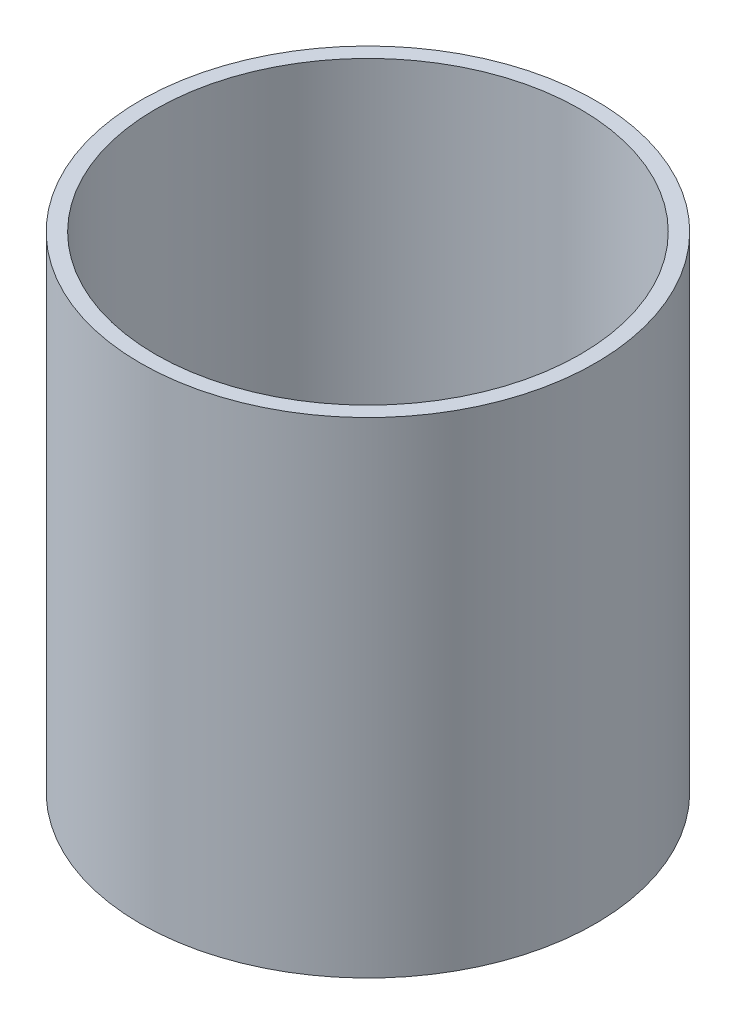
ISO-10303-21;
HEADER;
FILE_DESCRIPTION(('STEP AP214'),'2;1');
FILE_NAME('part.step','',(''),(''),'','','');
FILE_SCHEMA(('AUTOMOTIVE_DESIGN { 1 0 10303 214 1 1 1 1 }'));
ENDSEC;
DATA;
#1=APPLICATION_CONTEXT('core data for automotive mechanical design processes');
#2=APPLICATION_PROTOCOL_DEFINITION('international standard','automotive_design',2000,#1);
#3=PRODUCT_CONTEXT('',#1,'mechanical');
#4=PRODUCT('Part','Part','',(#3));
#5=PRODUCT_RELATED_PRODUCT_CATEGORY('part','',(#4));
#6=PRODUCT_DEFINITION_FORMATION('','',#4);
#7=PRODUCT_DEFINITION_CONTEXT('part definition',#1,'design');
#8=PRODUCT_DEFINITION('design','',#6,#7);
#9=PRODUCT_DEFINITION_SHAPE('','',#8);
#10=(LENGTH_UNIT() NAMED_UNIT(*) SI_UNIT(.MILLI.,.METRE.));
#11=(NAMED_UNIT(*) PLANE_ANGLE_UNIT() SI_UNIT($,.RADIAN.));
#12=(NAMED_UNIT(*) SI_UNIT($,.STERADIAN.) SOLID_ANGLE_UNIT());
#13=UNCERTAINTY_MEASURE_WITH_UNIT(LENGTH_MEASURE(1.E-05),#10,'distance_accuracy_value','');
#14=(GEOMETRIC_REPRESENTATION_CONTEXT(3) GLOBAL_UNCERTAINTY_ASSIGNED_CONTEXT((#13)) GLOBAL_UNIT_ASSIGNED_CONTEXT((#10,
#11,#12)) REPRESENTATION_CONTEXT('',''));
#15=CARTESIAN_POINT('',(0.,0.,0.));
#16=DIRECTION('',(0.,0.,1.));
#17=DIRECTION('',(1.,0.,0.));
#18=AXIS2_PLACEMENT_3D('',#15,#16,#17);
#19=CARTESIAN_POINT('',(0.,0.,0.));
#20=DIRECTION('',(0.,1.,0.));
#21=DIRECTION('',(0.,0.,1.));
#22=AXIS2_PLACEMENT_3D('',#19,#20,#21);
#23=PLANE('',#22);
#24=CARTESIAN_POINT('',(0.,0.,0.));
#25=DIRECTION('',(0.,1.,0.));
#26=DIRECTION('',(0.,0.,1.));
#27=AXIS2_PLACEMENT_3D('',#24,#25,#26);
#28=CIRCLE('',#27,44.);
#29=CARTESIAN_POINT('',(0.,0.,44.));
#30=VERTEX_POINT('',#29);
#31=EDGE_CURVE('E35',#30,#30,#28,.T.);
#32=ORIENTED_EDGE('',*,*,#31,.T.);
#33=EDGE_LOOP('',(#32));
#34=FACE_BOUND('',#33,.T.);
#35=CARTESIAN_POINT('',(0.,0.,0.));
#36=DIRECTION('',(0.,1.,0.));
#37=DIRECTION('',(0.,0.,1.));
#38=AXIS2_PLACEMENT_3D('',#35,#36,#37);
#39=CIRCLE('',#38,48.);
#40=CARTESIAN_POINT('',(0.,0.,48.));
#41=VERTEX_POINT('',#40);
#42=EDGE_CURVE('E10',#41,#41,#39,.T.);
#43=ORIENTED_EDGE('',*,*,#42,.F.);
#44=EDGE_LOOP('',(#43));
#45=FACE_BOUND('',#44,.T.);
#46=ADVANCED_FACE('F32',(#34,#45),#23,.F.);
#47=CARTESIAN_POINT('',(0.,136.,0.));
#48=DIRECTION('',(0.,1.,0.));
#49=DIRECTION('',(0.,0.,1.));
#50=AXIS2_PLACEMENT_3D('',#47,#48,#49);
#51=CYLINDRICAL_SURFACE('',#50,48.);
#52=CARTESIAN_POINT('',(0.,8.00000000000001,0.));
#53=DIRECTION('',(0.,1.,0.));
#54=DIRECTION('',(0.,0.,1.));
#55=AXIS2_PLACEMENT_3D('',#52,#53,#54);
#56=CIRCLE('',#55,48.);
#57=CARTESIAN_POINT('',(0.,8.00000000000001,48.));
#58=VERTEX_POINT('',#57);
#59=EDGE_CURVE('E39',#58,#58,#56,.T.);
#60=ORIENTED_EDGE('',*,*,#59,.F.);
#61=EDGE_LOOP('',(#60));
#62=FACE_BOUND('',#61,.T.);
#63=ORIENTED_EDGE('',*,*,#42,.T.);
#64=EDGE_LOOP('',(#63));
#65=FACE_BOUND('',#64,.T.);
#66=ADVANCED_FACE('F78',(#62,#65),#51,.T.);
#67=CARTESIAN_POINT('',(48.,8.,0.));
#68=DIRECTION('',(0.,1.,0.));
#69=DIRECTION('',(0.,0.,1.));
#70=AXIS2_PLACEMENT_3D('',#67,#68,#69);
#71=PLANE('',#70);
#72=CARTESIAN_POINT('',(0.,8.00000000000001,0.));
#73=DIRECTION('',(0.,1.,0.));
#74=DIRECTION('',(0.,0.,1.));
#75=AXIS2_PLACEMENT_3D('',#72,#73,#74);
#76=CIRCLE('',#75,60.);
#77=CARTESIAN_POINT('',(0.,8.00000000000001,60.));
#78=VERTEX_POINT('',#77);
#79=EDGE_CURVE('E43',#78,#78,#76,.T.);
#80=ORIENTED_EDGE('',*,*,#79,.F.);
#81=EDGE_LOOP('',(#80));
#82=FACE_BOUND('',#81,.T.);
#83=ORIENTED_EDGE('',*,*,#59,.T.);
#84=EDGE_LOOP('',(#83));
#85=FACE_BOUND('',#84,.T.);
#86=ADVANCED_FACE('F83',(#82,#85),#71,.F.);
#87=CARTESIAN_POINT('',(0.,136.,0.));
#88=DIRECTION('',(0.,1.,0.));
#89=DIRECTION('',(0.,0.,1.));
#90=AXIS2_PLACEMENT_3D('',#87,#88,#89);
#91=CYLINDRICAL_SURFACE('',#90,60.);
#92=CARTESIAN_POINT('',(0.,136.,0.));
#93=DIRECTION('',(0.,1.,0.));
#94=DIRECTION('',(0.,0.,1.));
#95=AXIS2_PLACEMENT_3D('',#92,#93,#94);
#96=CIRCLE('',#95,60.);
#97=CARTESIAN_POINT('',(0.,136.,60.));
#98=VERTEX_POINT('',#97);
#99=EDGE_CURVE('E48',#98,#98,#96,.T.);
#100=ORIENTED_EDGE('',*,*,#99,.F.);
#101=EDGE_LOOP('',(#100));
#102=FACE_BOUND('',#101,.T.);
#103=ORIENTED_EDGE('',*,*,#79,.T.);
#104=EDGE_LOOP('',(#103));
#105=FACE_BOUND('',#104,.T.);
#106=ADVANCED_FACE('F91',(#102,#105),#91,.T.);
#107=CARTESIAN_POINT('',(60.,136.,0.));
#108=DIRECTION('',(0.,-1.,0.));
#109=DIRECTION('',(0.,0.,-1.));
#110=AXIS2_PLACEMENT_3D('',#107,#108,#109);
#111=PLANE('',#110);
#112=CARTESIAN_POINT('',(0.,136.,0.));
#113=DIRECTION('',(0.,-1.,0.));
#114=DIRECTION('',(0.,0.,-1.));
#115=AXIS2_PLACEMENT_3D('',#112,#113,#114);
#116=CIRCLE('',#115,56.);
#117=CARTESIAN_POINT('',(0.,136.,-56.));
#118=VERTEX_POINT('',#117);
#119=EDGE_CURVE('E52',#118,#118,#116,.F.);
#120=ORIENTED_EDGE('',*,*,#119,.F.);
#121=EDGE_LOOP('',(#120));
#122=FACE_BOUND('',#121,.T.);
#123=ORIENTED_EDGE('',*,*,#99,.T.);
#124=EDGE_LOOP('',(#123));
#125=FACE_BOUND('',#124,.T.);
#126=ADVANCED_FACE('F75',(#122,#125),#111,.F.);
#127=CARTESIAN_POINT('',(0.,136.,0.));
#128=DIRECTION('',(0.,1.,0.));
#129=DIRECTION('',(0.,0.,1.));
#130=AXIS2_PLACEMENT_3D('',#127,#128,#129);
#131=CYLINDRICAL_SURFACE('',#130,44.);
#132=CARTESIAN_POINT('',(0.,12.,0.));
#133=DIRECTION('',(0.,1.,0.));
#134=DIRECTION('',(0.,0.,1.));
#135=AXIS2_PLACEMENT_3D('',#132,#133,#134);
#136=CIRCLE('',#135,44.);
#137=CARTESIAN_POINT('',(0.,12.,44.));
#138=VERTEX_POINT('',#137);
#139=EDGE_CURVE('E51',#138,#138,#136,.T.);
#140=ORIENTED_EDGE('',*,*,#139,.T.);
#141=EDGE_LOOP('',(#140));
#142=FACE_BOUND('',#141,.T.);
#143=ORIENTED_EDGE('',*,*,#31,.F.);
#144=EDGE_LOOP('',(#143));
#145=FACE_BOUND('',#144,.T.);
#146=ADVANCED_FACE('F61',(#142,#145),#131,.F.);
#147=CARTESIAN_POINT('',(48.,12.,0.));
#148=DIRECTION('',(0.,1.,0.));
#149=DIRECTION('',(0.,0.,1.));
#150=AXIS2_PLACEMENT_3D('',#147,#148,#149);
#151=PLANE('',#150);
#152=CARTESIAN_POINT('',(0.,12.,0.));
#153=DIRECTION('',(0.,1.,0.));
#154=DIRECTION('',(0.,0.,1.));
#155=AXIS2_PLACEMENT_3D('',#152,#153,#154);
#156=CIRCLE('',#155,56.);
#157=CARTESIAN_POINT('',(0.,12.,56.));
#158=VERTEX_POINT('',#157);
#159=EDGE_CURVE('E55',#158,#158,#156,.T.);
#160=ORIENTED_EDGE('',*,*,#159,.T.);
#161=EDGE_LOOP('',(#160));
#162=FACE_BOUND('',#161,.T.);
#163=ORIENTED_EDGE('',*,*,#139,.F.);
#164=EDGE_LOOP('',(#163));
#165=FACE_BOUND('',#164,.T.);
#166=ADVANCED_FACE('F64',(#162,#165),#151,.T.);
#167=CARTESIAN_POINT('',(0.,136.,0.));
#168=DIRECTION('',(0.,1.,0.));
#169=DIRECTION('',(0.,0.,1.));
#170=AXIS2_PLACEMENT_3D('',#167,#168,#169);
#171=CYLINDRICAL_SURFACE('',#170,56.);
#172=ORIENTED_EDGE('',*,*,#119,.T.);
#173=EDGE_LOOP('',(#172));
#174=FACE_BOUND('',#173,.T.);
#175=ORIENTED_EDGE('',*,*,#159,.F.);
#176=EDGE_LOOP('',(#175));
#177=FACE_BOUND('',#176,.T.);
#178=ADVANCED_FACE('F66',(#174,#177),#171,.F.);
#179=CLOSED_SHELL('',(#46,#66,#86,#106,#126,#146,#166,#178));
#180=MANIFOLD_SOLID_BREP('B2',#179);
#181=ADVANCED_BREP_SHAPE_REPRESENTATION('',(#18,#180),#14);
#182=SHAPE_DEFINITION_REPRESENTATION(#9,#181);
ENDSEC;
END-ISO-10303-21;
